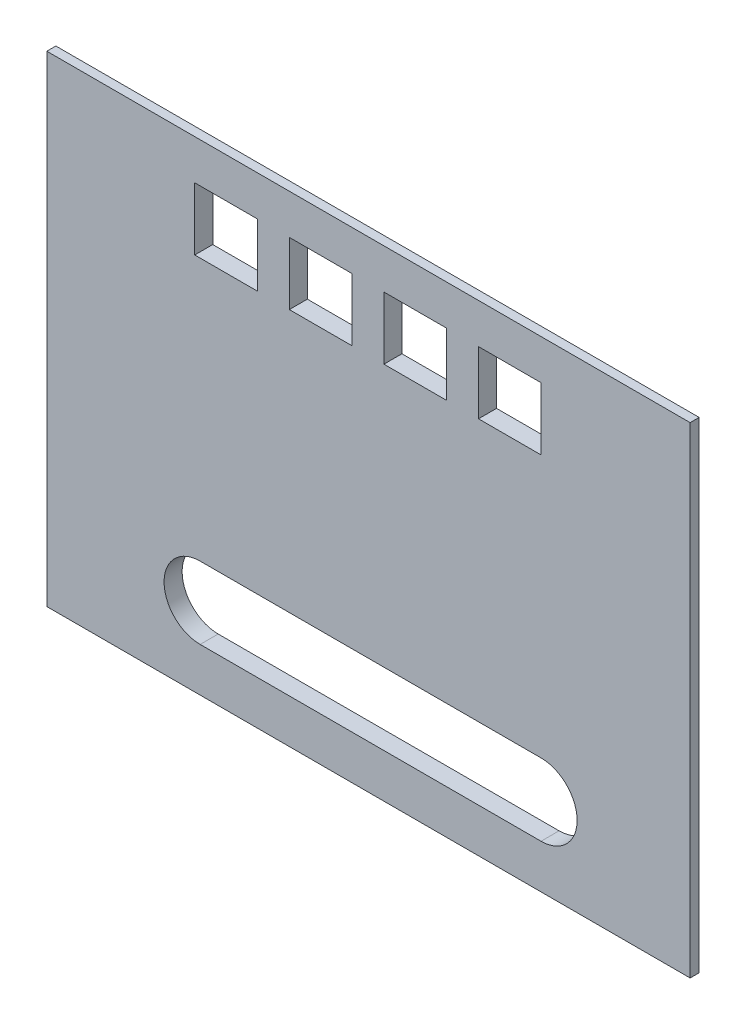
ISO-10303-21;
HEADER;
FILE_DESCRIPTION(('STEP AP214'),'2;1');
FILE_NAME('part.step','',(''),(''),'','','');
FILE_SCHEMA(('AUTOMOTIVE_DESIGN { 1 0 10303 214 1 1 1 1 }'));
ENDSEC;
DATA;
#1=APPLICATION_CONTEXT('core data for automotive mechanical design processes');
#2=APPLICATION_PROTOCOL_DEFINITION('international standard','automotive_design',2000,#1);
#3=PRODUCT_CONTEXT('',#1,'mechanical');
#4=PRODUCT('Part','Part','',(#3));
#5=PRODUCT_RELATED_PRODUCT_CATEGORY('part','',(#4));
#6=PRODUCT_DEFINITION_FORMATION('','',#4);
#7=PRODUCT_DEFINITION_CONTEXT('part definition',#1,'design');
#8=PRODUCT_DEFINITION('design','',#6,#7);
#9=PRODUCT_DEFINITION_SHAPE('','',#8);
#10=(LENGTH_UNIT() NAMED_UNIT(*) SI_UNIT(.MILLI.,.METRE.));
#11=(NAMED_UNIT(*) PLANE_ANGLE_UNIT() SI_UNIT($,.RADIAN.));
#12=(NAMED_UNIT(*) SI_UNIT($,.STERADIAN.) SOLID_ANGLE_UNIT());
#13=UNCERTAINTY_MEASURE_WITH_UNIT(LENGTH_MEASURE(1.E-05),#10,'distance_accuracy_value','');
#14=(GEOMETRIC_REPRESENTATION_CONTEXT(3) GLOBAL_UNCERTAINTY_ASSIGNED_CONTEXT((#13)) GLOBAL_UNIT_ASSIGNED_CONTEXT((#10,
#11,#12)) REPRESENTATION_CONTEXT('',''));
#15=CARTESIAN_POINT('',(0.,0.,0.));
#16=DIRECTION('',(0.,0.,1.));
#17=DIRECTION('',(1.,0.,0.));
#18=AXIS2_PLACEMENT_3D('',#15,#16,#17);
#19=CARTESIAN_POINT('',(3.,3.,3.));
#20=DIRECTION('',(1.,0.,0.));
#21=DIRECTION('',(0.,0.,-1.));
#22=AXIS2_PLACEMENT_3D('',#19,#20,#21);
#23=PLANE('',#22);
#24=DIRECTION('',(0.,0.,-1.));
#25=VECTOR('',#24,1.);
#26=CARTESIAN_POINT('',(3.,3.,3.));
#27=LINE('',#26,#25);
#28=CARTESIAN_POINT('',(3.,3.,1.5));
#29=VERTEX_POINT('',#28);
#30=CARTESIAN_POINT('',(3.,3.,0.));
#31=VERTEX_POINT('',#30);
#32=EDGE_CURVE('E46',#29,#31,#27,.T.);
#33=ORIENTED_EDGE('',*,*,#32,.F.);
#34=DIRECTION('',(0.,1.,0.));
#35=VECTOR('',#34,1.);
#36=CARTESIAN_POINT('',(3.,3.,1.5));
#37=LINE('',#36,#35);
#38=CARTESIAN_POINT('',(3.,77.,1.5));
#39=VERTEX_POINT('',#38);
#40=EDGE_CURVE('E408',#29,#39,#37,.T.);
#41=ORIENTED_EDGE('',*,*,#40,.T.);
#42=DIRECTION('',(0.,0.,-1.));
#43=VECTOR('',#42,1.);
#44=CARTESIAN_POINT('',(3.,77.,3.));
#45=LINE('',#44,#43);
#46=CARTESIAN_POINT('',(3.,77.,0.));
#47=VERTEX_POINT('',#46);
#48=EDGE_CURVE('E423',#39,#47,#45,.T.);
#49=ORIENTED_EDGE('',*,*,#48,.T.);
#50=DIRECTION('',(0.,-1.,0.));
#51=VECTOR('',#50,1.);
#52=CARTESIAN_POINT('',(3.,3.,0.));
#53=LINE('',#52,#51);
#54=EDGE_CURVE('E411',#47,#31,#53,.T.);
#55=ORIENTED_EDGE('',*,*,#54,.T.);
#56=EDGE_LOOP('',(#33,#41,#49,#55));
#57=FACE_BOUND('',#56,.T.);
#58=ADVANCED_FACE('F39',(#57),#23,.F.);
#59=CARTESIAN_POINT('',(3.,3.,3.));
#60=DIRECTION('',(0.,1.,0.));
#61=DIRECTION('',(0.,0.,1.));
#62=AXIS2_PLACEMENT_3D('',#59,#60,#61);
#63=PLANE('',#62);
#64=DIRECTION('',(0.,0.,-1.));
#65=VECTOR('',#64,1.);
#66=CARTESIAN_POINT('',(104.,3.,3.));
#67=LINE('',#66,#65);
#68=CARTESIAN_POINT('',(104.,3.,1.5));
#69=VERTEX_POINT('',#68);
#70=CARTESIAN_POINT('',(104.,3.,0.));
#71=VERTEX_POINT('',#70);
#72=EDGE_CURVE('E427',#69,#71,#67,.T.);
#73=ORIENTED_EDGE('',*,*,#72,.F.);
#74=DIRECTION('',(-1.,0.,0.));
#75=VECTOR('',#74,1.);
#76=CARTESIAN_POINT('',(3.,3.,1.5));
#77=LINE('',#76,#75);
#78=EDGE_CURVE('E405',#69,#29,#77,.T.);
#79=ORIENTED_EDGE('',*,*,#78,.T.);
#80=ORIENTED_EDGE('',*,*,#32,.T.);
#81=DIRECTION('',(1.,0.,0.));
#82=VECTOR('',#81,1.);
#83=CARTESIAN_POINT('',(3.,3.,0.));
#84=LINE('',#83,#82);
#85=EDGE_CURVE('E414',#31,#71,#84,.T.);
#86=ORIENTED_EDGE('',*,*,#85,.T.);
#87=EDGE_LOOP('',(#73,#79,#80,#86));
#88=FACE_BOUND('',#87,.T.);
#89=ADVANCED_FACE('F432',(#88),#63,.F.);
#90=CARTESIAN_POINT('',(104.,3.,3.));
#91=DIRECTION('',(-1.,0.,0.));
#92=DIRECTION('',(0.,0.,1.));
#93=AXIS2_PLACEMENT_3D('',#90,#91,#92);
#94=PLANE('',#93);
#95=DIRECTION('',(0.,0.,-1.));
#96=VECTOR('',#95,1.);
#97=CARTESIAN_POINT('',(104.,77.,3.));
#98=LINE('',#97,#96);
#99=CARTESIAN_POINT('',(104.,77.,1.5));
#100=VERTEX_POINT('',#99);
#101=CARTESIAN_POINT('',(104.,77.,0.));
#102=VERTEX_POINT('',#101);
#103=EDGE_CURVE('E425',#100,#102,#98,.T.);
#104=ORIENTED_EDGE('',*,*,#103,.F.);
#105=DIRECTION('',(0.,-1.,0.));
#106=VECTOR('',#105,1.);
#107=CARTESIAN_POINT('',(104.,3.,1.5));
#108=LINE('',#107,#106);
#109=EDGE_CURVE('E402',#100,#69,#108,.T.);
#110=ORIENTED_EDGE('',*,*,#109,.T.);
#111=ORIENTED_EDGE('',*,*,#72,.T.);
#112=DIRECTION('',(0.,1.,0.));
#113=VECTOR('',#112,1.);
#114=CARTESIAN_POINT('',(104.,3.,0.));
#115=LINE('',#114,#113);
#116=EDGE_CURVE('E417',#71,#102,#115,.T.);
#117=ORIENTED_EDGE('',*,*,#116,.T.);
#118=EDGE_LOOP('',(#104,#110,#111,#117));
#119=FACE_BOUND('',#118,.T.);
#120=ADVANCED_FACE('F444',(#119),#94,.F.);
#121=CARTESIAN_POINT('',(3.,77.,3.));
#122=DIRECTION('',(0.,-1.,0.));
#123=DIRECTION('',(0.,0.,-1.));
#124=AXIS2_PLACEMENT_3D('',#121,#122,#123);
#125=PLANE('',#124);
#126=ORIENTED_EDGE('',*,*,#48,.F.);
#127=DIRECTION('',(1.,0.,0.));
#128=VECTOR('',#127,1.);
#129=CARTESIAN_POINT('',(3.,77.,1.5));
#130=LINE('',#129,#128);
#131=EDGE_CURVE('E11',#39,#100,#130,.T.);
#132=ORIENTED_EDGE('',*,*,#131,.T.);
#133=ORIENTED_EDGE('',*,*,#103,.T.);
#134=DIRECTION('',(-1.,0.,0.));
#135=VECTOR('',#134,1.);
#136=CARTESIAN_POINT('',(3.,77.,0.));
#137=LINE('',#136,#135);
#138=EDGE_CURVE('E420',#102,#47,#137,.T.);
#139=ORIENTED_EDGE('',*,*,#138,.T.);
#140=EDGE_LOOP('',(#126,#132,#133,#139));
#141=FACE_BOUND('',#140,.T.);
#142=ADVANCED_FACE('F441',(#141),#125,.F.);
#143=CARTESIAN_POINT('',(0.,0.,0.));
#144=DIRECTION('',(0.,0.,-1.));
#145=DIRECTION('',(-1.,0.,0.));
#146=AXIS2_PLACEMENT_3D('',#143,#144,#145);
#147=PLANE('',#146);
#148=DIRECTION('',(0.,1.,0.));
#149=VECTOR('',#148,1.);
#150=CARTESIAN_POINT('',(40.333,0.,0.));
#151=LINE('',#150,#149);
#152=CARTESIAN_POINT('',(40.333,62.95,0.));
#153=VERTEX_POINT('',#152);
#154=CARTESIAN_POINT('',(40.333,73.35,0.));
#155=VERTEX_POINT('',#154);
#156=EDGE_CURVE('E370',#153,#155,#151,.T.);
#157=ORIENTED_EDGE('',*,*,#156,.F.);
#158=DIRECTION('',(-1.,0.,0.));
#159=VECTOR('',#158,1.);
#160=CARTESIAN_POINT('',(0.,62.95,0.));
#161=LINE('',#160,#159);
#162=CARTESIAN_POINT('',(50.733,62.95,0.));
#163=VERTEX_POINT('',#162);
#164=EDGE_CURVE('E364',#163,#153,#161,.T.);
#165=ORIENTED_EDGE('',*,*,#164,.F.);
#166=DIRECTION('',(0.,-1.,0.));
#167=VECTOR('',#166,1.);
#168=CARTESIAN_POINT('',(50.733,0.,0.));
#169=LINE('',#168,#167);
#170=CARTESIAN_POINT('',(50.733,73.35,0.));
#171=VERTEX_POINT('',#170);
#172=EDGE_CURVE('E366',#171,#163,#169,.T.);
#173=ORIENTED_EDGE('',*,*,#172,.F.);
#174=DIRECTION('',(1.,0.,0.));
#175=VECTOR('',#174,1.);
#176=CARTESIAN_POINT('',(0.,73.35,0.));
#177=LINE('',#176,#175);
#178=EDGE_CURVE('E368',#155,#171,#177,.T.);
#179=ORIENTED_EDGE('',*,*,#178,.F.);
#180=EDGE_LOOP('',(#157,#165,#173,#179));
#181=FACE_BOUND('',#180,.T.);
#182=DIRECTION('',(0.,1.,0.));
#183=VECTOR('',#182,1.);
#184=CARTESIAN_POINT('',(56.067,0.,0.));
#185=LINE('',#184,#183);
#186=CARTESIAN_POINT('',(56.067,62.95,0.));
#187=VERTEX_POINT('',#186);
#188=CARTESIAN_POINT('',(56.067,73.35,0.));
#189=VERTEX_POINT('',#188);
#190=EDGE_CURVE('E362',#187,#189,#185,.T.);
#191=ORIENTED_EDGE('',*,*,#190,.F.);
#192=DIRECTION('',(-1.,0.,0.));
#193=VECTOR('',#192,1.);
#194=CARTESIAN_POINT('',(0.,62.95,0.));
#195=LINE('',#194,#193);
#196=CARTESIAN_POINT('',(66.467,62.95,0.));
#197=VERTEX_POINT('',#196);
#198=EDGE_CURVE('E356',#197,#187,#195,.T.);
#199=ORIENTED_EDGE('',*,*,#198,.F.);
#200=DIRECTION('',(0.,-1.,0.));
#201=VECTOR('',#200,1.);
#202=CARTESIAN_POINT('',(66.467,0.,0.));
#203=LINE('',#202,#201);
#204=CARTESIAN_POINT('',(66.467,73.35,0.));
#205=VERTEX_POINT('',#204);
#206=EDGE_CURVE('E358',#205,#197,#203,.T.);
#207=ORIENTED_EDGE('',*,*,#206,.F.);
#208=DIRECTION('',(1.,0.,0.));
#209=VECTOR('',#208,1.);
#210=CARTESIAN_POINT('',(0.,73.35,0.));
#211=LINE('',#210,#209);
#212=EDGE_CURVE('E360',#189,#205,#211,.T.);
#213=ORIENTED_EDGE('',*,*,#212,.F.);
#214=EDGE_LOOP('',(#191,#199,#207,#213));
#215=FACE_BOUND('',#214,.T.);
#216=DIRECTION('',(0.,1.,0.));
#217=VECTOR('',#216,1.);
#218=CARTESIAN_POINT('',(71.8,0.,0.));
#219=LINE('',#218,#217);
#220=CARTESIAN_POINT('',(71.8,62.95,0.));
#221=VERTEX_POINT('',#220);
#222=CARTESIAN_POINT('',(71.8,73.35,0.));
#223=VERTEX_POINT('',#222);
#224=EDGE_CURVE('E230',#221,#223,#219,.T.);
#225=ORIENTED_EDGE('',*,*,#224,.F.);
#226=DIRECTION('',(-1.,0.,0.));
#227=VECTOR('',#226,1.);
#228=CARTESIAN_POINT('',(0.,62.95,0.));
#229=LINE('',#228,#227);
#230=CARTESIAN_POINT('',(82.2,62.95,0.));
#231=VERTEX_POINT('',#230);
#232=EDGE_CURVE('E348',#231,#221,#229,.T.);
#233=ORIENTED_EDGE('',*,*,#232,.F.);
#234=DIRECTION('',(0.,-1.,0.));
#235=VECTOR('',#234,1.);
#236=CARTESIAN_POINT('',(82.2,0.,0.));
#237=LINE('',#236,#235);
#238=CARTESIAN_POINT('',(82.2,73.35,0.));
#239=VERTEX_POINT('',#238);
#240=EDGE_CURVE('E350',#239,#231,#237,.T.);
#241=ORIENTED_EDGE('',*,*,#240,.F.);
#242=DIRECTION('',(1.,0.,0.));
#243=VECTOR('',#242,1.);
#244=CARTESIAN_POINT('',(0.,73.35,0.));
#245=LINE('',#244,#243);
#246=EDGE_CURVE('E353',#223,#239,#245,.T.);
#247=ORIENTED_EDGE('',*,*,#246,.F.);
#248=EDGE_LOOP('',(#225,#233,#241,#247));
#249=FACE_BOUND('',#248,.T.);
#250=CARTESIAN_POINT('',(25.5,13.3,0.));
#251=DIRECTION('',(0.,0.,-1.));
#252=DIRECTION('',(-1.,0.,0.));
#253=AXIS2_PLACEMENT_3D('',#250,#251,#252);
#254=CIRCLE('',#253,6.);
#255=CARTESIAN_POINT('',(25.5,7.3,0.));
#256=VERTEX_POINT('',#255);
#257=CARTESIAN_POINT('',(25.5,19.3,0.));
#258=VERTEX_POINT('',#257);
#259=EDGE_CURVE('E346',#256,#258,#254,.T.);
#260=ORIENTED_EDGE('',*,*,#259,.F.);
#261=DIRECTION('',(-1.,0.,0.));
#262=VECTOR('',#261,1.);
#263=CARTESIAN_POINT('',(0.,7.3,0.));
#264=LINE('',#263,#262);
#265=CARTESIAN_POINT('',(82.2,7.3,0.));
#266=VERTEX_POINT('',#265);
#267=EDGE_CURVE('E339',#266,#256,#264,.T.);
#268=ORIENTED_EDGE('',*,*,#267,.F.);
#269=CARTESIAN_POINT('',(82.2,13.3,0.));
#270=DIRECTION('',(0.,0.,-1.));
#271=DIRECTION('',(-1.,0.,0.));
#272=AXIS2_PLACEMENT_3D('',#269,#270,#271);
#273=CIRCLE('',#272,6.);
#274=CARTESIAN_POINT('',(82.2,19.3,0.));
#275=VERTEX_POINT('',#274);
#276=EDGE_CURVE('E341',#275,#266,#273,.T.);
#277=ORIENTED_EDGE('',*,*,#276,.F.);
#278=DIRECTION('',(1.,0.,0.));
#279=VECTOR('',#278,1.);
#280=CARTESIAN_POINT('',(0.,19.3,0.));
#281=LINE('',#280,#279);
#282=EDGE_CURVE('E344',#258,#275,#281,.T.);
#283=ORIENTED_EDGE('',*,*,#282,.F.);
#284=EDGE_LOOP('',(#260,#268,#277,#283));
#285=FACE_BOUND('',#284,.T.);
#286=DIRECTION('',(0.,1.,0.));
#287=VECTOR('',#286,1.);
#288=CARTESIAN_POINT('',(24.6,0.,0.));
#289=LINE('',#288,#287);
#290=CARTESIAN_POINT('',(24.6,62.95,0.));
#291=VERTEX_POINT('',#290);
#292=CARTESIAN_POINT('',(24.6,73.35,0.));
#293=VERTEX_POINT('',#292);
#294=EDGE_CURVE('E337',#291,#293,#289,.T.);
#295=ORIENTED_EDGE('',*,*,#294,.F.);
#296=DIRECTION('',(-1.,0.,0.));
#297=VECTOR('',#296,1.);
#298=CARTESIAN_POINT('',(0.,62.95,0.));
#299=LINE('',#298,#297);
#300=CARTESIAN_POINT('',(35.,62.95,0.));
#301=VERTEX_POINT('',#300);
#302=EDGE_CURVE('E324',#301,#291,#299,.T.);
#303=ORIENTED_EDGE('',*,*,#302,.F.);
#304=DIRECTION('',(0.,-1.,0.));
#305=VECTOR('',#304,1.);
#306=CARTESIAN_POINT('',(35.,0.,0.));
#307=LINE('',#306,#305);
#308=CARTESIAN_POINT('',(35.,73.35,0.));
#309=VERTEX_POINT('',#308);
#310=EDGE_CURVE('E332',#309,#301,#307,.T.);
#311=ORIENTED_EDGE('',*,*,#310,.F.);
#312=DIRECTION('',(1.,0.,0.));
#313=VECTOR('',#312,1.);
#314=CARTESIAN_POINT('',(0.,73.35,0.));
#315=LINE('',#314,#313);
#316=EDGE_CURVE('E335',#293,#309,#315,.T.);
#317=ORIENTED_EDGE('',*,*,#316,.F.);
#318=EDGE_LOOP('',(#295,#303,#311,#317));
#319=FACE_BOUND('',#318,.T.);
#320=ORIENTED_EDGE('',*,*,#54,.F.);
#321=ORIENTED_EDGE('',*,*,#138,.F.);
#322=ORIENTED_EDGE('',*,*,#116,.F.);
#323=ORIENTED_EDGE('',*,*,#85,.F.);
#324=EDGE_LOOP('',(#320,#321,#322,#323));
#325=FACE_BOUND('',#324,.T.);
#326=ADVANCED_FACE('F437',(#181,#215,#249,#285,#319,#325),#147,.T.);
#327=CARTESIAN_POINT('',(0.,0.,1.5));
#328=DIRECTION('',(0.,0.,-1.));
#329=DIRECTION('',(-1.,0.,0.));
#330=AXIS2_PLACEMENT_3D('',#327,#328,#329);
#331=PLANE('',#330);
#332=DIRECTION('',(0.,-1.,0.));
#333=VECTOR('',#332,1.);
#334=CARTESIAN_POINT('',(0.,0.,1.5));
#335=LINE('',#334,#333);
#336=CARTESIAN_POINT('',(0.,80.,1.5));
#337=VERTEX_POINT('',#336);
#338=CARTESIAN_POINT('',(0.,0.,1.5));
#339=VERTEX_POINT('',#338);
#340=EDGE_CURVE('E372',#337,#339,#335,.T.);
#341=ORIENTED_EDGE('',*,*,#340,.F.);
#342=DIRECTION('',(-1.,0.,0.));
#343=VECTOR('',#342,1.);
#344=CARTESIAN_POINT('',(0.,80.,1.5));
#345=LINE('',#344,#343);
#346=CARTESIAN_POINT('',(107.,80.,1.5));
#347=VERTEX_POINT('',#346);
#348=EDGE_CURVE('E377',#347,#337,#345,.T.);
#349=ORIENTED_EDGE('',*,*,#348,.F.);
#350=DIRECTION('',(0.,1.,0.));
#351=VECTOR('',#350,1.);
#352=CARTESIAN_POINT('',(107.,0.,1.5));
#353=LINE('',#352,#351);
#354=CARTESIAN_POINT('',(107.,0.,1.5));
#355=VERTEX_POINT('',#354);
#356=EDGE_CURVE('E388',#355,#347,#353,.T.);
#357=ORIENTED_EDGE('',*,*,#356,.F.);
#358=DIRECTION('',(1.,0.,0.));
#359=VECTOR('',#358,1.);
#360=CARTESIAN_POINT('',(0.,0.,1.5));
#361=LINE('',#360,#359);
#362=EDGE_CURVE('E386',#339,#355,#361,.T.);
#363=ORIENTED_EDGE('',*,*,#362,.F.);
#364=EDGE_LOOP('',(#341,#349,#357,#363));
#365=FACE_BOUND('',#364,.T.);
#366=ORIENTED_EDGE('',*,*,#40,.F.);
#367=ORIENTED_EDGE('',*,*,#78,.F.);
#368=ORIENTED_EDGE('',*,*,#109,.F.);
#369=ORIENTED_EDGE('',*,*,#131,.F.);
#370=EDGE_LOOP('',(#366,#367,#368,#369));
#371=FACE_BOUND('',#370,.T.);
#372=ADVANCED_FACE('F446',(#365,#371),#331,.T.);
#373=CARTESIAN_POINT('',(0.,0.,3.));
#374=DIRECTION('',(1.,0.,0.));
#375=DIRECTION('',(0.,0.,-1.));
#376=AXIS2_PLACEMENT_3D('',#373,#374,#375);
#377=PLANE('',#376);
#378=ORIENTED_EDGE('',*,*,#340,.T.);
#379=DIRECTION('',(0.,0.,-1.));
#380=VECTOR('',#379,1.);
#381=CARTESIAN_POINT('',(0.,0.,3.));
#382=LINE('',#381,#380);
#383=CARTESIAN_POINT('',(0.,0.,3.));
#384=VERTEX_POINT('',#383);
#385=EDGE_CURVE('E399',#384,#339,#382,.T.);
#386=ORIENTED_EDGE('',*,*,#385,.F.);
#387=DIRECTION('',(0.,-1.,0.));
#388=VECTOR('',#387,1.);
#389=CARTESIAN_POINT('',(0.,0.,3.));
#390=LINE('',#389,#388);
#391=CARTESIAN_POINT('',(0.,80.,3.));
#392=VERTEX_POINT('',#391);
#393=EDGE_CURVE('E373',#392,#384,#390,.T.);
#394=ORIENTED_EDGE('',*,*,#393,.F.);
#395=DIRECTION('',(0.,0.,-1.));
#396=VECTOR('',#395,1.);
#397=CARTESIAN_POINT('',(0.,80.,3.));
#398=LINE('',#397,#396);
#399=EDGE_CURVE('E383',#392,#337,#398,.T.);
#400=ORIENTED_EDGE('',*,*,#399,.T.);
#401=EDGE_LOOP('',(#378,#386,#394,#400));
#402=FACE_BOUND('',#401,.T.);
#403=ADVANCED_FACE('F448',(#402),#377,.F.);
#404=CARTESIAN_POINT('',(0.,0.,3.));
#405=DIRECTION('',(0.,1.,0.));
#406=DIRECTION('',(0.,0.,1.));
#407=AXIS2_PLACEMENT_3D('',#404,#405,#406);
#408=PLANE('',#407);
#409=ORIENTED_EDGE('',*,*,#362,.T.);
#410=DIRECTION('',(0.,0.,-1.));
#411=VECTOR('',#410,1.);
#412=CARTESIAN_POINT('',(107.,0.,3.));
#413=LINE('',#412,#411);
#414=CARTESIAN_POINT('',(107.,0.,3.));
#415=VERTEX_POINT('',#414);
#416=EDGE_CURVE('E396',#415,#355,#413,.T.);
#417=ORIENTED_EDGE('',*,*,#416,.F.);
#418=DIRECTION('',(1.,0.,0.));
#419=VECTOR('',#418,1.);
#420=CARTESIAN_POINT('',(0.,0.,3.));
#421=LINE('',#420,#419);
#422=EDGE_CURVE('E376',#384,#415,#421,.T.);
#423=ORIENTED_EDGE('',*,*,#422,.F.);
#424=ORIENTED_EDGE('',*,*,#385,.T.);
#425=EDGE_LOOP('',(#409,#417,#423,#424));
#426=FACE_BOUND('',#425,.T.);
#427=ADVANCED_FACE('F455',(#426),#408,.F.);
#428=CARTESIAN_POINT('',(107.,0.,3.));
#429=DIRECTION('',(-1.,0.,0.));
#430=DIRECTION('',(0.,0.,1.));
#431=AXIS2_PLACEMENT_3D('',#428,#429,#430);
#432=PLANE('',#431);
#433=ORIENTED_EDGE('',*,*,#356,.T.);
#434=DIRECTION('',(0.,0.,-1.));
#435=VECTOR('',#434,1.);
#436=CARTESIAN_POINT('',(107.,80.,3.));
#437=LINE('',#436,#435);
#438=CARTESIAN_POINT('',(107.,80.,3.));
#439=VERTEX_POINT('',#438);
#440=EDGE_CURVE('E393',#439,#347,#437,.T.);
#441=ORIENTED_EDGE('',*,*,#440,.F.);
#442=DIRECTION('',(0.,1.,0.));
#443=VECTOR('',#442,1.);
#444=CARTESIAN_POINT('',(107.,0.,3.));
#445=LINE('',#444,#443);
#446=EDGE_CURVE('E379',#415,#439,#445,.T.);
#447=ORIENTED_EDGE('',*,*,#446,.F.);
#448=ORIENTED_EDGE('',*,*,#416,.T.);
#449=EDGE_LOOP('',(#433,#441,#447,#448));
#450=FACE_BOUND('',#449,.T.);
#451=ADVANCED_FACE('F481',(#450),#432,.F.);
#452=CARTESIAN_POINT('',(0.,80.,3.));
#453=DIRECTION('',(0.,-1.,0.));
#454=DIRECTION('',(0.,0.,-1.));
#455=AXIS2_PLACEMENT_3D('',#452,#453,#454);
#456=PLANE('',#455);
#457=ORIENTED_EDGE('',*,*,#348,.T.);
#458=ORIENTED_EDGE('',*,*,#399,.F.);
#459=DIRECTION('',(-1.,0.,0.));
#460=VECTOR('',#459,1.);
#461=CARTESIAN_POINT('',(0.,80.,3.));
#462=LINE('',#461,#460);
#463=EDGE_CURVE('E381',#439,#392,#462,.T.);
#464=ORIENTED_EDGE('',*,*,#463,.F.);
#465=ORIENTED_EDGE('',*,*,#440,.T.);
#466=EDGE_LOOP('',(#457,#458,#464,#465));
#467=FACE_BOUND('',#466,.T.);
#468=ADVANCED_FACE('F476',(#467),#456,.F.);
#469=CARTESIAN_POINT('',(0.,0.,3.));
#470=DIRECTION('',(0.,0.,-1.));
#471=DIRECTION('',(-1.,0.,0.));
#472=AXIS2_PLACEMENT_3D('',#469,#470,#471);
#473=PLANE('',#472);
#474=DIRECTION('',(1.,0.,0.));
#475=VECTOR('',#474,1.);
#476=CARTESIAN_POINT('',(40.333,62.95,3.));
#477=LINE('',#476,#475);
#478=CARTESIAN_POINT('',(40.333,62.95,3.));
#479=VERTEX_POINT('',#478);
#480=CARTESIAN_POINT('',(50.733,62.95,3.));
#481=VERTEX_POINT('',#480);
#482=EDGE_CURVE('E292',#479,#481,#477,.T.);
#483=ORIENTED_EDGE('',*,*,#482,.F.);
#484=DIRECTION('',(0.,-1.,0.));
#485=VECTOR('',#484,1.);
#486=CARTESIAN_POINT('',(40.333,62.95,3.));
#487=LINE('',#486,#485);
#488=CARTESIAN_POINT('',(40.333,73.35,3.));
#489=VERTEX_POINT('',#488);
#490=EDGE_CURVE('E294',#489,#479,#487,.T.);
#491=ORIENTED_EDGE('',*,*,#490,.F.);
#492=DIRECTION('',(-1.,0.,0.));
#493=VECTOR('',#492,1.);
#494=CARTESIAN_POINT('',(40.333,73.35,3.));
#495=LINE('',#494,#493);
#496=CARTESIAN_POINT('',(50.733,73.35,3.));
#497=VERTEX_POINT('',#496);
#498=EDGE_CURVE('E280',#497,#489,#495,.T.);
#499=ORIENTED_EDGE('',*,*,#498,.F.);
#500=DIRECTION('',(0.,1.,0.));
#501=VECTOR('',#500,1.);
#502=CARTESIAN_POINT('',(50.733,62.95,3.));
#503=LINE('',#502,#501);
#504=EDGE_CURVE('E289',#481,#497,#503,.T.);
#505=ORIENTED_EDGE('',*,*,#504,.F.);
#506=EDGE_LOOP('',(#483,#491,#499,#505));
#507=FACE_BOUND('',#506,.T.);
#508=DIRECTION('',(1.,0.,0.));
#509=VECTOR('',#508,1.);
#510=CARTESIAN_POINT('',(56.067,62.95,3.));
#511=LINE('',#510,#509);
#512=CARTESIAN_POINT('',(56.067,62.95,3.));
#513=VERTEX_POINT('',#512);
#514=CARTESIAN_POINT('',(66.467,62.95,3.));
#515=VERTEX_POINT('',#514);
#516=EDGE_CURVE('E308',#513,#515,#511,.T.);
#517=ORIENTED_EDGE('',*,*,#516,.F.);
#518=DIRECTION('',(0.,-1.,0.));
#519=VECTOR('',#518,1.);
#520=CARTESIAN_POINT('',(56.067,62.95,3.));
#521=LINE('',#520,#519);
#522=CARTESIAN_POINT('',(56.067,73.35,3.));
#523=VERTEX_POINT('',#522);
#524=EDGE_CURVE('E286',#523,#513,#521,.T.);
#525=ORIENTED_EDGE('',*,*,#524,.F.);
#526=DIRECTION('',(-1.,0.,0.));
#527=VECTOR('',#526,1.);
#528=CARTESIAN_POINT('',(56.067,73.35,3.));
#529=LINE('',#528,#527);
#530=CARTESIAN_POINT('',(66.467,73.35,3.));
#531=VERTEX_POINT('',#530);
#532=EDGE_CURVE('E300',#531,#523,#529,.T.);
#533=ORIENTED_EDGE('',*,*,#532,.F.);
#534=DIRECTION('',(0.,1.,0.));
#535=VECTOR('',#534,1.);
#536=CARTESIAN_POINT('',(66.467,62.95,3.));
#537=LINE('',#536,#535);
#538=EDGE_CURVE('E305',#515,#531,#537,.T.);
#539=ORIENTED_EDGE('',*,*,#538,.F.);
#540=EDGE_LOOP('',(#517,#525,#533,#539));
#541=FACE_BOUND('',#540,.T.);
#542=DIRECTION('',(1.,0.,0.));
#543=VECTOR('',#542,1.);
#544=CARTESIAN_POINT('',(71.8,62.95,3.));
#545=LINE('',#544,#543);
#546=CARTESIAN_POINT('',(71.8,62.95,3.));
#547=VERTEX_POINT('',#546);
#548=CARTESIAN_POINT('',(82.2,62.95,3.));
#549=VERTEX_POINT('',#548);
#550=EDGE_CURVE('E250',#547,#549,#545,.T.);
#551=ORIENTED_EDGE('',*,*,#550,.F.);
#552=DIRECTION('',(0.,-1.,0.));
#553=VECTOR('',#552,1.);
#554=CARTESIAN_POINT('',(71.8,62.95,3.));
#555=LINE('',#554,#553);
#556=CARTESIAN_POINT('',(71.8,73.35,3.));
#557=VERTEX_POINT('',#556);
#558=EDGE_CURVE('E227',#557,#547,#555,.T.);
#559=ORIENTED_EDGE('',*,*,#558,.F.);
#560=DIRECTION('',(-1.,0.,0.));
#561=VECTOR('',#560,1.);
#562=CARTESIAN_POINT('',(71.8,73.35,3.));
#563=LINE('',#562,#561);
#564=CARTESIAN_POINT('',(82.2,73.35,3.));
#565=VERTEX_POINT('',#564);
#566=EDGE_CURVE('E237',#565,#557,#563,.T.);
#567=ORIENTED_EDGE('',*,*,#566,.F.);
#568=DIRECTION('',(0.,1.,0.));
#569=VECTOR('',#568,1.);
#570=CARTESIAN_POINT('',(82.2,62.95,3.));
#571=LINE('',#570,#569);
#572=EDGE_CURVE('E243',#549,#565,#571,.T.);
#573=ORIENTED_EDGE('',*,*,#572,.F.);
#574=EDGE_LOOP('',(#551,#559,#567,#573));
#575=FACE_BOUND('',#574,.T.);
#576=DIRECTION('',(1.,0.,0.));
#577=VECTOR('',#576,1.);
#578=CARTESIAN_POINT('',(25.5,7.3,3.));
#579=LINE('',#578,#577);
#580=CARTESIAN_POINT('',(25.5,7.3,3.));
#581=VERTEX_POINT('',#580);
#582=CARTESIAN_POINT('',(82.2,7.3,3.));
#583=VERTEX_POINT('',#582);
#584=EDGE_CURVE('E273',#581,#583,#579,.T.);
#585=ORIENTED_EDGE('',*,*,#584,.F.);
#586=CARTESIAN_POINT('',(25.5,13.3,3.));
#587=DIRECTION('',(0.,0.,1.));
#588=DIRECTION('',(1.,0.,0.));
#589=AXIS2_PLACEMENT_3D('',#586,#587,#588);
#590=CIRCLE('',#589,6.);
#591=CARTESIAN_POINT('',(25.5,19.3,3.));
#592=VERTEX_POINT('',#591);
#593=EDGE_CURVE('E234',#592,#581,#590,.T.);
#594=ORIENTED_EDGE('',*,*,#593,.F.);
#595=DIRECTION('',(-1.,0.,0.));
#596=VECTOR('',#595,1.);
#597=CARTESIAN_POINT('',(25.5,19.3,3.));
#598=LINE('',#597,#596);
#599=CARTESIAN_POINT('',(82.2,19.3,3.));
#600=VERTEX_POINT('',#599);
#601=EDGE_CURVE('E261',#600,#592,#598,.T.);
#602=ORIENTED_EDGE('',*,*,#601,.F.);
#603=CARTESIAN_POINT('',(82.2,13.3,3.));
#604=DIRECTION('',(0.,0.,1.));
#605=DIRECTION('',(1.,0.,0.));
#606=AXIS2_PLACEMENT_3D('',#603,#604,#605);
#607=CIRCLE('',#606,6.);
#608=EDGE_CURVE('E270',#583,#600,#607,.T.);
#609=ORIENTED_EDGE('',*,*,#608,.F.);
#610=EDGE_LOOP('',(#585,#594,#602,#609));
#611=FACE_BOUND('',#610,.T.);
#612=DIRECTION('',(1.,0.,0.));
#613=VECTOR('',#612,1.);
#614=CARTESIAN_POINT('',(24.6,62.95,3.));
#615=LINE('',#614,#613);
#616=CARTESIAN_POINT('',(24.6,62.95,3.));
#617=VERTEX_POINT('',#616);
#618=CARTESIAN_POINT('',(35.,62.95,3.));
#619=VERTEX_POINT('',#618);
#620=EDGE_CURVE('E312',#617,#619,#615,.T.);
#621=ORIENTED_EDGE('',*,*,#620,.F.);
#622=DIRECTION('',(0.,-1.,0.));
#623=VECTOR('',#622,1.);
#624=CARTESIAN_POINT('',(24.6,62.95,3.));
#625=LINE('',#624,#623);
#626=CARTESIAN_POINT('',(24.6,73.35,3.));
#627=VERTEX_POINT('',#626);
#628=EDGE_CURVE('E296',#627,#617,#625,.T.);
#629=ORIENTED_EDGE('',*,*,#628,.F.);
#630=DIRECTION('',(-1.,0.,0.));
#631=VECTOR('',#630,1.);
#632=CARTESIAN_POINT('',(24.6,73.35,3.));
#633=LINE('',#632,#631);
#634=CARTESIAN_POINT('',(35.,73.35,3.));
#635=VERTEX_POINT('',#634);
#636=EDGE_CURVE('E318',#635,#627,#633,.T.);
#637=ORIENTED_EDGE('',*,*,#636,.F.);
#638=DIRECTION('',(0.,1.,0.));
#639=VECTOR('',#638,1.);
#640=CARTESIAN_POINT('',(35.,62.95,3.));
#641=LINE('',#640,#639);
#642=EDGE_CURVE('E315',#619,#635,#641,.T.);
#643=ORIENTED_EDGE('',*,*,#642,.F.);
#644=EDGE_LOOP('',(#621,#629,#637,#643));
#645=FACE_BOUND('',#644,.T.);
#646=ORIENTED_EDGE('',*,*,#393,.T.);
#647=ORIENTED_EDGE('',*,*,#422,.T.);
#648=ORIENTED_EDGE('',*,*,#446,.T.);
#649=ORIENTED_EDGE('',*,*,#463,.T.);
#650=EDGE_LOOP('',(#646,#647,#648,#649));
#651=FACE_BOUND('',#650,.T.);
#652=ADVANCED_FACE('F247',(#507,#541,#575,#611,#645,#651),#473,.F.);
#653=CARTESIAN_POINT('',(24.6,62.95,-2.));
#654=DIRECTION('',(-1.,0.,0.));
#655=DIRECTION('',(0.,0.,1.));
#656=AXIS2_PLACEMENT_3D('',#653,#654,#655);
#657=PLANE('',#656);
#658=ORIENTED_EDGE('',*,*,#294,.T.);
#659=DIRECTION('',(0.,0.,1.));
#660=VECTOR('',#659,1.);
#661=CARTESIAN_POINT('',(24.6,73.35,-2.));
#662=LINE('',#661,#660);
#663=EDGE_CURVE('E322',#293,#627,#662,.T.);
#664=ORIENTED_EDGE('',*,*,#663,.T.);
#665=ORIENTED_EDGE('',*,*,#628,.T.);
#666=DIRECTION('',(0.,0.,1.));
#667=VECTOR('',#666,1.);
#668=CARTESIAN_POINT('',(24.6,62.95,-2.));
#669=LINE('',#668,#667);
#670=EDGE_CURVE('E321',#291,#617,#669,.T.);
#671=ORIENTED_EDGE('',*,*,#670,.F.);
#672=EDGE_LOOP('',(#658,#664,#665,#671));
#673=FACE_BOUND('',#672,.T.);
#674=ADVANCED_FACE('F475',(#673),#657,.F.);
#675=CARTESIAN_POINT('',(24.6,73.35,-2.));
#676=DIRECTION('',(0.,1.,0.));
#677=DIRECTION('',(0.,0.,1.));
#678=AXIS2_PLACEMENT_3D('',#675,#676,#677);
#679=PLANE('',#678);
#680=ORIENTED_EDGE('',*,*,#316,.T.);
#681=DIRECTION('',(0.,0.,1.));
#682=VECTOR('',#681,1.);
#683=CARTESIAN_POINT('',(35.,73.35,-2.));
#684=LINE('',#683,#682);
#685=EDGE_CURVE('E325',#309,#635,#684,.T.);
#686=ORIENTED_EDGE('',*,*,#685,.T.);
#687=ORIENTED_EDGE('',*,*,#636,.T.);
#688=ORIENTED_EDGE('',*,*,#663,.F.);
#689=EDGE_LOOP('',(#680,#686,#687,#688));
#690=FACE_BOUND('',#689,.T.);
#691=ADVANCED_FACE('F518',(#690),#679,.F.);
#692=CARTESIAN_POINT('',(35.,62.95,-2.));
#693=DIRECTION('',(1.,0.,0.));
#694=DIRECTION('',(0.,0.,-1.));
#695=AXIS2_PLACEMENT_3D('',#692,#693,#694);
#696=PLANE('',#695);
#697=ORIENTED_EDGE('',*,*,#310,.T.);
#698=DIRECTION('',(0.,0.,1.));
#699=VECTOR('',#698,1.);
#700=CARTESIAN_POINT('',(35.,62.95,-2.));
#701=LINE('',#700,#699);
#702=EDGE_CURVE('E327',#301,#619,#701,.T.);
#703=ORIENTED_EDGE('',*,*,#702,.T.);
#704=ORIENTED_EDGE('',*,*,#642,.T.);
#705=ORIENTED_EDGE('',*,*,#685,.F.);
#706=EDGE_LOOP('',(#697,#703,#704,#705));
#707=FACE_BOUND('',#706,.T.);
#708=ADVANCED_FACE('F526',(#707),#696,.F.);
#709=CARTESIAN_POINT('',(24.6,62.95,-2.));
#710=DIRECTION('',(0.,-1.,0.));
#711=DIRECTION('',(0.,0.,-1.));
#712=AXIS2_PLACEMENT_3D('',#709,#710,#711);
#713=PLANE('',#712);
#714=ORIENTED_EDGE('',*,*,#302,.T.);
#715=ORIENTED_EDGE('',*,*,#670,.T.);
#716=ORIENTED_EDGE('',*,*,#620,.T.);
#717=ORIENTED_EDGE('',*,*,#702,.F.);
#718=EDGE_LOOP('',(#714,#715,#716,#717));
#719=FACE_BOUND('',#718,.T.);
#720=ADVANCED_FACE('F535',(#719),#713,.F.);
#721=CARTESIAN_POINT('',(25.5,13.3,-2.));
#722=DIRECTION('',(0.,0.,1.));
#723=DIRECTION('',(1.,0.,0.));
#724=AXIS2_PLACEMENT_3D('',#721,#722,#723);
#725=CYLINDRICAL_SURFACE('',#724,6.);
#726=ORIENTED_EDGE('',*,*,#259,.T.);
#727=DIRECTION('',(0.,0.,1.));
#728=VECTOR('',#727,1.);
#729=CARTESIAN_POINT('',(25.5,19.3,-2.));
#730=LINE('',#729,#728);
#731=EDGE_CURVE('E266',#258,#592,#730,.T.);
#732=ORIENTED_EDGE('',*,*,#731,.T.);
#733=ORIENTED_EDGE('',*,*,#593,.T.);
#734=DIRECTION('',(0.,0.,1.));
#735=VECTOR('',#734,1.);
#736=CARTESIAN_POINT('',(25.5,7.3,-2.));
#737=LINE('',#736,#735);
#738=EDGE_CURVE('E258',#256,#581,#737,.T.);
#739=ORIENTED_EDGE('',*,*,#738,.F.);
#740=EDGE_LOOP('',(#726,#732,#733,#739));
#741=FACE_BOUND('',#740,.T.);
#742=ADVANCED_FACE('F544',(#741),#725,.F.);
#743=CARTESIAN_POINT('',(25.5,19.3,-2.));
#744=DIRECTION('',(0.,1.,0.));
#745=DIRECTION('',(0.,0.,1.));
#746=AXIS2_PLACEMENT_3D('',#743,#744,#745);
#747=PLANE('',#746);
#748=ORIENTED_EDGE('',*,*,#282,.T.);
#749=DIRECTION('',(0.,0.,1.));
#750=VECTOR('',#749,1.);
#751=CARTESIAN_POINT('',(82.2,19.3,-2.));
#752=LINE('',#751,#750);
#753=EDGE_CURVE('E264',#275,#600,#752,.T.);
#754=ORIENTED_EDGE('',*,*,#753,.T.);
#755=ORIENTED_EDGE('',*,*,#601,.T.);
#756=ORIENTED_EDGE('',*,*,#731,.F.);
#757=EDGE_LOOP('',(#748,#754,#755,#756));
#758=FACE_BOUND('',#757,.T.);
#759=ADVANCED_FACE('F553',(#758),#747,.F.);
#760=CARTESIAN_POINT('',(82.2,13.3,-2.));
#761=DIRECTION('',(0.,0.,1.));
#762=DIRECTION('',(1.,0.,0.));
#763=AXIS2_PLACEMENT_3D('',#760,#761,#762);
#764=CYLINDRICAL_SURFACE('',#763,6.);
#765=ORIENTED_EDGE('',*,*,#276,.T.);
#766=DIRECTION('',(0.,0.,1.));
#767=VECTOR('',#766,1.);
#768=CARTESIAN_POINT('',(82.2,7.3,-2.));
#769=LINE('',#768,#767);
#770=EDGE_CURVE('E262',#266,#583,#769,.T.);
#771=ORIENTED_EDGE('',*,*,#770,.T.);
#772=ORIENTED_EDGE('',*,*,#608,.T.);
#773=ORIENTED_EDGE('',*,*,#753,.F.);
#774=EDGE_LOOP('',(#765,#771,#772,#773));
#775=FACE_BOUND('',#774,.T.);
#776=ADVANCED_FACE('F562',(#775),#764,.F.);
#777=CARTESIAN_POINT('',(25.5,7.3,-2.));
#778=DIRECTION('',(0.,-1.,0.));
#779=DIRECTION('',(0.,0.,-1.));
#780=AXIS2_PLACEMENT_3D('',#777,#778,#779);
#781=PLANE('',#780);
#782=ORIENTED_EDGE('',*,*,#267,.T.);
#783=ORIENTED_EDGE('',*,*,#738,.T.);
#784=ORIENTED_EDGE('',*,*,#584,.T.);
#785=ORIENTED_EDGE('',*,*,#770,.F.);
#786=EDGE_LOOP('',(#782,#783,#784,#785));
#787=FACE_BOUND('',#786,.T.);
#788=ADVANCED_FACE('F571',(#787),#781,.F.);
#789=CARTESIAN_POINT('',(71.8,62.95,-2.));
#790=DIRECTION('',(-1.,0.,0.));
#791=DIRECTION('',(0.,0.,1.));
#792=AXIS2_PLACEMENT_3D('',#789,#790,#791);
#793=PLANE('',#792);
#794=ORIENTED_EDGE('',*,*,#224,.T.);
#795=DIRECTION('',(0.,0.,1.));
#796=VECTOR('',#795,1.);
#797=CARTESIAN_POINT('',(71.8,73.35,-2.));
#798=LINE('',#797,#796);
#799=EDGE_CURVE('E222',#223,#557,#798,.T.);
#800=ORIENTED_EDGE('',*,*,#799,.T.);
#801=ORIENTED_EDGE('',*,*,#558,.T.);
#802=DIRECTION('',(0.,0.,1.));
#803=VECTOR('',#802,1.);
#804=CARTESIAN_POINT('',(71.8,62.95,-2.));
#805=LINE('',#804,#803);
#806=EDGE_CURVE('E244',#221,#547,#805,.T.);
#807=ORIENTED_EDGE('',*,*,#806,.F.);
#808=EDGE_LOOP('',(#794,#800,#801,#807));
#809=FACE_BOUND('',#808,.T.);
#810=ADVANCED_FACE('F224',(#809),#793,.F.);
#811=CARTESIAN_POINT('',(71.8,73.35,-2.));
#812=DIRECTION('',(0.,1.,0.));
#813=DIRECTION('',(0.,0.,1.));
#814=AXIS2_PLACEMENT_3D('',#811,#812,#813);
#815=PLANE('',#814);
#816=ORIENTED_EDGE('',*,*,#246,.T.);
#817=DIRECTION('',(0.,0.,1.));
#818=VECTOR('',#817,1.);
#819=CARTESIAN_POINT('',(82.2,73.35,-2.));
#820=LINE('',#819,#818);
#821=EDGE_CURVE('E233',#239,#565,#820,.T.);
#822=ORIENTED_EDGE('',*,*,#821,.T.);
#823=ORIENTED_EDGE('',*,*,#566,.T.);
#824=ORIENTED_EDGE('',*,*,#799,.F.);
#825=EDGE_LOOP('',(#816,#822,#823,#824));
#826=FACE_BOUND('',#825,.T.);
#827=ADVANCED_FACE('F238',(#826),#815,.F.);
#828=CARTESIAN_POINT('',(82.2,62.95,-2.));
#829=DIRECTION('',(1.,0.,0.));
#830=DIRECTION('',(0.,0.,-1.));
#831=AXIS2_PLACEMENT_3D('',#828,#829,#830);
#832=PLANE('',#831);
#833=ORIENTED_EDGE('',*,*,#240,.T.);
#834=DIRECTION('',(0.,0.,1.));
#835=VECTOR('',#834,1.);
#836=CARTESIAN_POINT('',(82.2,62.95,-2.));
#837=LINE('',#836,#835);
#838=EDGE_CURVE('E804',#231,#549,#837,.T.);
#839=ORIENTED_EDGE('',*,*,#838,.T.);
#840=ORIENTED_EDGE('',*,*,#572,.T.);
#841=ORIENTED_EDGE('',*,*,#821,.F.);
#842=EDGE_LOOP('',(#833,#839,#840,#841));
#843=FACE_BOUND('',#842,.T.);
#844=ADVANCED_FACE('F595',(#843),#832,.F.);
#845=CARTESIAN_POINT('',(71.8,62.95,-2.));
#846=DIRECTION('',(0.,-1.,0.));
#847=DIRECTION('',(0.,0.,-1.));
#848=AXIS2_PLACEMENT_3D('',#845,#846,#847);
#849=PLANE('',#848);
#850=ORIENTED_EDGE('',*,*,#232,.T.);
#851=ORIENTED_EDGE('',*,*,#806,.T.);
#852=ORIENTED_EDGE('',*,*,#550,.T.);
#853=ORIENTED_EDGE('',*,*,#838,.F.);
#854=EDGE_LOOP('',(#850,#851,#852,#853));
#855=FACE_BOUND('',#854,.T.);
#856=ADVANCED_FACE('F603',(#855),#849,.F.);
#857=CARTESIAN_POINT('',(56.067,62.95,-2.));
#858=DIRECTION('',(-1.,0.,0.));
#859=DIRECTION('',(0.,0.,1.));
#860=AXIS2_PLACEMENT_3D('',#857,#858,#859);
#861=PLANE('',#860);
#862=ORIENTED_EDGE('',*,*,#190,.T.);
#863=DIRECTION('',(0.,0.,1.));
#864=VECTOR('',#863,1.);
#865=CARTESIAN_POINT('',(56.067,73.35,-2.));
#866=LINE('',#865,#864);
#867=EDGE_CURVE('E251',#189,#523,#866,.T.);
#868=ORIENTED_EDGE('',*,*,#867,.T.);
#869=ORIENTED_EDGE('',*,*,#524,.T.);
#870=DIRECTION('',(0.,0.,1.));
#871=VECTOR('',#870,1.);
#872=CARTESIAN_POINT('',(56.067,62.95,-2.));
#873=LINE('',#872,#871);
#874=EDGE_CURVE('E297',#187,#513,#873,.T.);
#875=ORIENTED_EDGE('',*,*,#874,.F.);
#876=EDGE_LOOP('',(#862,#868,#869,#875));
#877=FACE_BOUND('',#876,.T.);
#878=ADVANCED_FACE('F612',(#877),#861,.F.);
#879=CARTESIAN_POINT('',(56.067,73.35,-2.));
#880=DIRECTION('',(0.,1.,0.));
#881=DIRECTION('',(0.,0.,1.));
#882=AXIS2_PLACEMENT_3D('',#879,#880,#881);
#883=PLANE('',#882);
#884=ORIENTED_EDGE('',*,*,#212,.T.);
#885=DIRECTION('',(0.,0.,1.));
#886=VECTOR('',#885,1.);
#887=CARTESIAN_POINT('',(66.467,73.35,-2.));
#888=LINE('',#887,#886);
#889=EDGE_CURVE('E253',#205,#531,#888,.T.);
#890=ORIENTED_EDGE('',*,*,#889,.T.);
#891=ORIENTED_EDGE('',*,*,#532,.T.);
#892=ORIENTED_EDGE('',*,*,#867,.F.);
#893=EDGE_LOOP('',(#884,#890,#891,#892));
#894=FACE_BOUND('',#893,.T.);
#895=ADVANCED_FACE('F621',(#894),#883,.F.);
#896=CARTESIAN_POINT('',(66.467,62.95,-2.));
#897=DIRECTION('',(1.,0.,0.));
#898=DIRECTION('',(0.,0.,-1.));
#899=AXIS2_PLACEMENT_3D('',#896,#897,#898);
#900=PLANE('',#899);
#901=ORIENTED_EDGE('',*,*,#206,.T.);
#902=DIRECTION('',(0.,0.,1.));
#903=VECTOR('',#902,1.);
#904=CARTESIAN_POINT('',(66.467,62.95,-2.));
#905=LINE('',#904,#903);
#906=EDGE_CURVE('E61',#197,#515,#905,.T.);
#907=ORIENTED_EDGE('',*,*,#906,.T.);
#908=ORIENTED_EDGE('',*,*,#538,.T.);
#909=ORIENTED_EDGE('',*,*,#889,.F.);
#910=EDGE_LOOP('',(#901,#907,#908,#909));
#911=FACE_BOUND('',#910,.T.);
#912=ADVANCED_FACE('F630',(#911),#900,.F.);
#913=CARTESIAN_POINT('',(56.067,62.95,-2.));
#914=DIRECTION('',(0.,-1.,0.));
#915=DIRECTION('',(0.,0.,-1.));
#916=AXIS2_PLACEMENT_3D('',#913,#914,#915);
#917=PLANE('',#916);
#918=ORIENTED_EDGE('',*,*,#198,.T.);
#919=ORIENTED_EDGE('',*,*,#874,.T.);
#920=ORIENTED_EDGE('',*,*,#516,.T.);
#921=ORIENTED_EDGE('',*,*,#906,.F.);
#922=EDGE_LOOP('',(#918,#919,#920,#921));
#923=FACE_BOUND('',#922,.T.);
#924=ADVANCED_FACE('F639',(#923),#917,.F.);
#925=CARTESIAN_POINT('',(40.333,62.95,-2.));
#926=DIRECTION('',(-1.,0.,0.));
#927=DIRECTION('',(0.,0.,1.));
#928=AXIS2_PLACEMENT_3D('',#925,#926,#927);
#929=PLANE('',#928);
#930=ORIENTED_EDGE('',*,*,#156,.T.);
#931=DIRECTION('',(0.,0.,1.));
#932=VECTOR('',#931,1.);
#933=CARTESIAN_POINT('',(40.333,73.35,-2.));
#934=LINE('',#933,#932);
#935=EDGE_CURVE('E284',#155,#489,#934,.T.);
#936=ORIENTED_EDGE('',*,*,#935,.T.);
#937=ORIENTED_EDGE('',*,*,#490,.T.);
#938=DIRECTION('',(0.,0.,1.));
#939=VECTOR('',#938,1.);
#940=CARTESIAN_POINT('',(40.333,62.95,-2.));
#941=LINE('',#940,#939);
#942=EDGE_CURVE('E277',#153,#479,#941,.T.);
#943=ORIENTED_EDGE('',*,*,#942,.F.);
#944=EDGE_LOOP('',(#930,#936,#937,#943));
#945=FACE_BOUND('',#944,.T.);
#946=ADVANCED_FACE('F648',(#945),#929,.F.);
#947=CARTESIAN_POINT('',(40.333,73.35,-2.));
#948=DIRECTION('',(0.,1.,0.));
#949=DIRECTION('',(0.,0.,1.));
#950=AXIS2_PLACEMENT_3D('',#947,#948,#949);
#951=PLANE('',#950);
#952=ORIENTED_EDGE('',*,*,#178,.T.);
#953=DIRECTION('',(0.,0.,1.));
#954=VECTOR('',#953,1.);
#955=CARTESIAN_POINT('',(50.733,73.35,-2.));
#956=LINE('',#955,#954);
#957=EDGE_CURVE('E282',#171,#497,#956,.T.);
#958=ORIENTED_EDGE('',*,*,#957,.T.);
#959=ORIENTED_EDGE('',*,*,#498,.T.);
#960=ORIENTED_EDGE('',*,*,#935,.F.);
#961=EDGE_LOOP('',(#952,#958,#959,#960));
#962=FACE_BOUND('',#961,.T.);
#963=ADVANCED_FACE('F656',(#962),#951,.F.);
#964=CARTESIAN_POINT('',(50.733,62.95,-2.));
#965=DIRECTION('',(1.,0.,0.));
#966=DIRECTION('',(0.,0.,-1.));
#967=AXIS2_PLACEMENT_3D('',#964,#965,#966);
#968=PLANE('',#967);
#969=ORIENTED_EDGE('',*,*,#172,.T.);
#970=DIRECTION('',(0.,0.,1.));
#971=VECTOR('',#970,1.);
#972=CARTESIAN_POINT('',(50.733,62.95,-2.));
#973=LINE('',#972,#971);
#974=EDGE_CURVE('E53',#163,#481,#973,.T.);
#975=ORIENTED_EDGE('',*,*,#974,.T.);
#976=ORIENTED_EDGE('',*,*,#504,.T.);
#977=ORIENTED_EDGE('',*,*,#957,.F.);
#978=EDGE_LOOP('',(#969,#975,#976,#977));
#979=FACE_BOUND('',#978,.T.);
#980=ADVANCED_FACE('F665',(#979),#968,.F.);
#981=CARTESIAN_POINT('',(40.333,62.95,-2.));
#982=DIRECTION('',(0.,-1.,0.));
#983=DIRECTION('',(0.,0.,-1.));
#984=AXIS2_PLACEMENT_3D('',#981,#982,#983);
#985=PLANE('',#984);
#986=ORIENTED_EDGE('',*,*,#164,.T.);
#987=ORIENTED_EDGE('',*,*,#942,.T.);
#988=ORIENTED_EDGE('',*,*,#482,.T.);
#989=ORIENTED_EDGE('',*,*,#974,.F.);
#990=EDGE_LOOP('',(#986,#987,#988,#989));
#991=FACE_BOUND('',#990,.T.);
#992=ADVANCED_FACE('F674',(#991),#985,.F.);
#993=CLOSED_SHELL('',(#58,#89,#120,#142,#326,#372,#403,#427,#451,#468,#652,#674,#691,#708,#720,
#742,#759,#776,#788,#810,#827,#844,#856,#878,#895,#912,#924,#946,#963,#980,#992));
#994=MANIFOLD_SOLID_BREP('B2',#993);
#995=ADVANCED_BREP_SHAPE_REPRESENTATION('',(#18,#994),#14);
#996=SHAPE_DEFINITION_REPRESENTATION(#9,#995);
ENDSEC;
END-ISO-10303-21;
